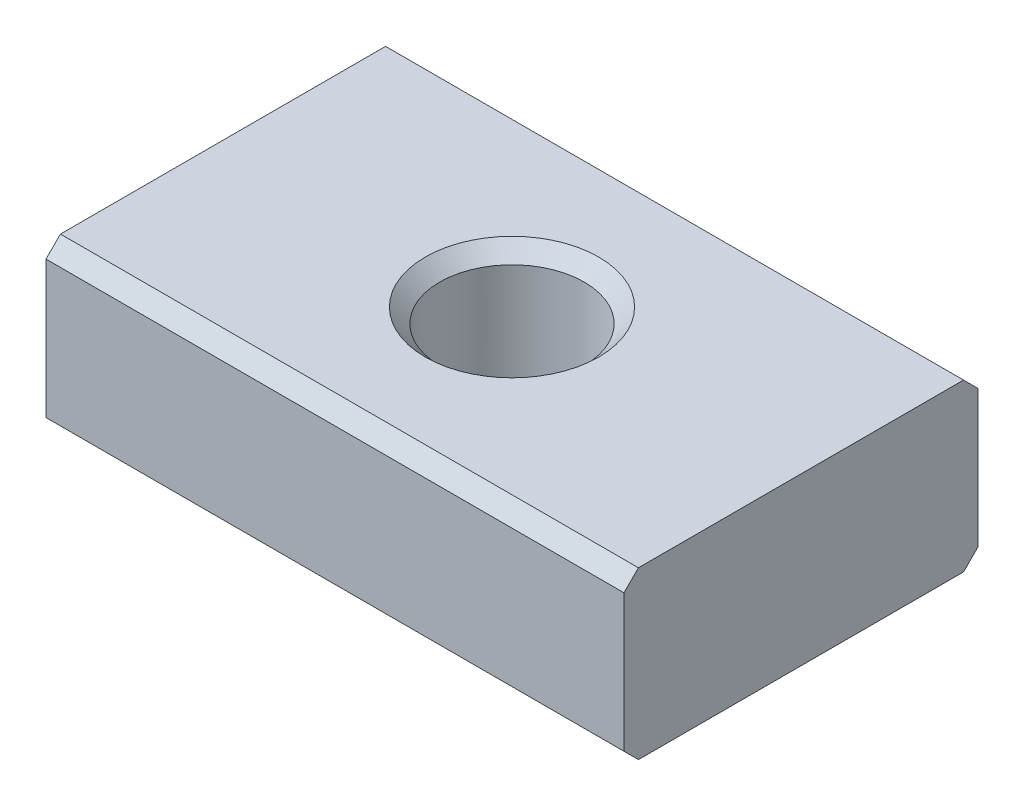
ISO-10303-21;
HEADER;
FILE_DESCRIPTION(('STEP AP214'),'2;1');
FILE_NAME('part.step','',(''),(''),'','','');
FILE_SCHEMA(('AUTOMOTIVE_DESIGN { 1 0 10303 214 1 1 1 1 }'));
ENDSEC;
DATA;
#1=APPLICATION_CONTEXT('core data for automotive mechanical design processes');
#2=APPLICATION_PROTOCOL_DEFINITION('international standard','automotive_design',2000,#1);
#3=PRODUCT_CONTEXT('',#1,'mechanical');
#4=PRODUCT('Part','Part','',(#3));
#5=PRODUCT_RELATED_PRODUCT_CATEGORY('part','',(#4));
#6=PRODUCT_DEFINITION_FORMATION('','',#4);
#7=PRODUCT_DEFINITION_CONTEXT('part definition',#1,'design');
#8=PRODUCT_DEFINITION('design','',#6,#7);
#9=PRODUCT_DEFINITION_SHAPE('','',#8);
#10=(LENGTH_UNIT() NAMED_UNIT(*) SI_UNIT(.MILLI.,.METRE.));
#11=(NAMED_UNIT(*) PLANE_ANGLE_UNIT() SI_UNIT($,.RADIAN.));
#12=(NAMED_UNIT(*) SI_UNIT($,.STERADIAN.) SOLID_ANGLE_UNIT());
#13=UNCERTAINTY_MEASURE_WITH_UNIT(LENGTH_MEASURE(1.E-05),#10,'distance_accuracy_value','');
#14=(GEOMETRIC_REPRESENTATION_CONTEXT(3) GLOBAL_UNCERTAINTY_ASSIGNED_CONTEXT((#13)) GLOBAL_UNIT_ASSIGNED_CONTEXT((#10,
#11,#12)) REPRESENTATION_CONTEXT('',''));
#15=CARTESIAN_POINT('',(0.,0.,0.));
#16=DIRECTION('',(0.,0.,1.));
#17=DIRECTION('',(1.,0.,0.));
#18=AXIS2_PLACEMENT_3D('',#15,#16,#17);
#19=CARTESIAN_POINT('',(238.313927280234,-604.415511703491,-854.486148834229));
#20=DIRECTION('',(0.,-0.707106781186548,-0.707106781186547));
#21=DIRECTION('',(0.,0.707106781186547,-0.707106781186548));
#22=AXIS2_PLACEMENT_3D('',#19,#20,#21);
#23=PLANE('',#22);
#24=DIRECTION('',(1.,0.,0.));
#25=VECTOR('',#24,1.);
#26=CARTESIAN_POINT('',(238.313927280234,-603.91551170349,-854.986148834229));
#27=LINE('',#26,#25);
#28=CARTESIAN_POINT('',(218.313933383242,-603.91551170349,-854.986148834229));
#29=VERTEX_POINT('',#28);
#30=CARTESIAN_POINT('',(258.313921177225,-603.91551170349,-854.986148834229));
#31=VERTEX_POINT('',#30);
#32=EDGE_CURVE('E116',#29,#31,#27,.T.);
#33=ORIENTED_EDGE('',*,*,#32,.F.);
#34=DIRECTION('',(0.,0.707106781186547,-0.707106781186548));
#35=VECTOR('',#34,1.);
#36=CARTESIAN_POINT('',(218.313933383242,-604.415511703491,-854.486148834229));
#37=LINE('',#36,#35);
#38=CARTESIAN_POINT('',(218.313933383242,-604.915511703492,-853.986148834228));
#39=VERTEX_POINT('',#38);
#40=EDGE_CURVE('E132',#39,#29,#37,.T.);
#41=ORIENTED_EDGE('',*,*,#40,.F.);
#42=DIRECTION('',(1.,0.,0.));
#43=VECTOR('',#42,1.);
#44=CARTESIAN_POINT('',(238.313927280234,-604.915511703492,-853.986148834228));
#45=LINE('',#44,#43);
#46=CARTESIAN_POINT('',(258.313921177225,-604.915511703492,-853.986148834228));
#47=VERTEX_POINT('',#46);
#48=EDGE_CURVE('E122',#47,#39,#45,.F.);
#49=ORIENTED_EDGE('',*,*,#48,.F.);
#50=DIRECTION('',(0.,0.707106781186547,-0.707106781186548));
#51=VECTOR('',#50,1.);
#52=CARTESIAN_POINT('',(258.313921177225,-604.415511703491,-854.486148834229));
#53=LINE('',#52,#51);
#54=EDGE_CURVE('E130',#31,#47,#53,.F.);
#55=ORIENTED_EDGE('',*,*,#54,.F.);
#56=EDGE_LOOP('',(#33,#41,#49,#55));
#57=FACE_BOUND('',#56,.T.);
#58=ADVANCED_FACE('F17',(#57),#23,.F.);
#59=CARTESIAN_POINT('',(238.313927280234,-604.415511703491,-877.986148834228));
#60=DIRECTION('',(0.,-0.707106781186548,0.707106781186547));
#61=DIRECTION('',(0.,-0.707106781186547,-0.707106781186548));
#62=AXIS2_PLACEMENT_3D('',#59,#60,#61);
#63=PLANE('',#62);
#64=DIRECTION('',(1.,0.,0.));
#65=VECTOR('',#64,1.);
#66=CARTESIAN_POINT('',(238.313927280234,-603.91551170349,-877.486148834228));
#67=LINE('',#66,#65);
#68=CARTESIAN_POINT('',(258.313921177225,-603.91551170349,-877.486148834228));
#69=VERTEX_POINT('',#68);
#70=CARTESIAN_POINT('',(218.313933383242,-603.91551170349,-877.486148834228));
#71=VERTEX_POINT('',#70);
#72=EDGE_CURVE('E119',#69,#71,#67,.F.);
#73=ORIENTED_EDGE('',*,*,#72,.F.);
#74=DIRECTION('',(0.,-0.707106781186547,-0.707106781186548));
#75=VECTOR('',#74,1.);
#76=CARTESIAN_POINT('',(258.313921177225,-604.415511703491,-877.986148834228));
#77=LINE('',#76,#75);
#78=CARTESIAN_POINT('',(258.313921177225,-604.915511703491,-878.486148834229));
#79=VERTEX_POINT('',#78);
#80=EDGE_CURVE('E78',#79,#69,#77,.F.);
#81=ORIENTED_EDGE('',*,*,#80,.F.);
#82=DIRECTION('',(1.,0.,0.));
#83=VECTOR('',#82,1.);
#84=CARTESIAN_POINT('',(238.313927280234,-604.915511703491,-878.486148834229));
#85=LINE('',#84,#83);
#86=CARTESIAN_POINT('',(218.313933383242,-604.915511703491,-878.486148834229));
#87=VERTEX_POINT('',#86);
#88=EDGE_CURVE('E99',#79,#87,#85,.F.);
#89=ORIENTED_EDGE('',*,*,#88,.T.);
#90=DIRECTION('',(0.,-0.707106781186547,-0.707106781186548));
#91=VECTOR('',#90,1.);
#92=CARTESIAN_POINT('',(218.313933383242,-604.415511703491,-877.986148834228));
#93=LINE('',#92,#91);
#94=EDGE_CURVE('E125',#71,#87,#93,.T.);
#95=ORIENTED_EDGE('',*,*,#94,.F.);
#96=EDGE_LOOP('',(#73,#81,#89,#95));
#97=FACE_BOUND('',#96,.T.);
#98=ADVANCED_FACE('F161',(#97),#63,.F.);
#99=CARTESIAN_POINT('',(238.313908971209,-603.91551170349,-866.236135779287));
#100=DIRECTION('',(0.,1.,0.));
#101=DIRECTION('',(0.,0.,1.));
#102=AXIS2_PLACEMENT_3D('',#99,#100,#101);
#103=CONICAL_SURFACE('',#102,6.00000000000001,0.785398163397448);
#104=CARTESIAN_POINT('',(238.313908971209,-604.915511703491,-866.236135779287));
#105=DIRECTION('',(0.,-1.,0.));
#106=DIRECTION('',(0.,0.,-1.));
#107=AXIS2_PLACEMENT_3D('',#104,#105,#106);
#108=CIRCLE('',#107,4.99999999999999);
#109=CARTESIAN_POINT('',(238.313908971209,-604.915511703491,-871.236135779287));
#110=VERTEX_POINT('',#109);
#111=EDGE_CURVE('E94',#110,#110,#108,.T.);
#112=ORIENTED_EDGE('',*,*,#111,.T.);
#113=EDGE_LOOP('',(#112));
#114=FACE_BOUND('',#113,.T.);
#115=CARTESIAN_POINT('',(238.313908971209,-603.91551170349,-866.236135779287));
#116=DIRECTION('',(0.,1.,0.));
#117=DIRECTION('',(0.,0.,1.));
#118=AXIS2_PLACEMENT_3D('',#115,#116,#117);
#119=CIRCLE('',#118,6.00000000000001);
#120=CARTESIAN_POINT('',(238.313908971209,-603.91551170349,-860.236135779287));
#121=VERTEX_POINT('',#120);
#122=EDGE_CURVE('E20',#121,#121,#119,.F.);
#123=ORIENTED_EDGE('',*,*,#122,.F.);
#124=EDGE_LOOP('',(#123));
#125=FACE_BOUND('',#124,.T.);
#126=ADVANCED_FACE('F176',(#114,#125),#103,.F.);
#127=CARTESIAN_POINT('',(238.313927280234,-609.66551170349,-853.986148834228));
#128=DIRECTION('',(0.,0.,1.));
#129=DIRECTION('',(1.,0.,0.));
#130=AXIS2_PLACEMENT_3D('',#127,#128,#129);
#131=PLANE('',#130);
#132=DIRECTION('',(1.,0.,0.));
#133=VECTOR('',#132,1.);
#134=CARTESIAN_POINT('',(238.313927280234,-614.415511703491,-853.986148834227));
#135=LINE('',#134,#133);
#136=CARTESIAN_POINT('',(218.313933383242,-614.41551170349,-853.986148834228));
#137=VERTEX_POINT('',#136);
#138=CARTESIAN_POINT('',(258.313921177225,-614.41551170349,-853.986148834228));
#139=VERTEX_POINT('',#138);
#140=EDGE_CURVE('E157',#137,#139,#135,.T.);
#141=ORIENTED_EDGE('',*,*,#140,.T.);
#142=DIRECTION('',(0.,1.,0.));
#143=VECTOR('',#142,1.);
#144=CARTESIAN_POINT('',(258.313921177225,-609.66551170349,-853.986148834228));
#145=LINE('',#144,#143);
#146=EDGE_CURVE('E159',#47,#139,#145,.F.);
#147=ORIENTED_EDGE('',*,*,#146,.F.);
#148=ORIENTED_EDGE('',*,*,#48,.T.);
#149=DIRECTION('',(0.,1.,0.));
#150=VECTOR('',#149,1.);
#151=CARTESIAN_POINT('',(218.313933383242,-609.66551170349,-853.986148834228));
#152=LINE('',#151,#150);
#153=EDGE_CURVE('E141',#137,#39,#152,.T.);
#154=ORIENTED_EDGE('',*,*,#153,.F.);
#155=EDGE_LOOP('',(#141,#147,#148,#154));
#156=FACE_BOUND('',#155,.T.);
#157=ADVANCED_FACE('F174',(#156),#131,.T.);
#158=CARTESIAN_POINT('',(238.313927280234,-603.91551170349,-866.23614883423));
#159=DIRECTION('',(0.,1.,0.));
#160=DIRECTION('',(0.,0.,1.));
#161=AXIS2_PLACEMENT_3D('',#158,#159,#160);
#162=PLANE('',#161);
#163=ORIENTED_EDGE('',*,*,#122,.T.);
#164=EDGE_LOOP('',(#163));
#165=FACE_BOUND('',#164,.T.);
#166=ORIENTED_EDGE('',*,*,#32,.T.);
#167=DIRECTION('',(0.,0.,-1.));
#168=VECTOR('',#167,1.);
#169=CARTESIAN_POINT('',(258.313921177225,-603.91551170349,-866.23614883423));
#170=LINE('',#169,#168);
#171=EDGE_CURVE('E101',#69,#31,#170,.F.);
#172=ORIENTED_EDGE('',*,*,#171,.F.);
#173=ORIENTED_EDGE('',*,*,#72,.T.);
#174=DIRECTION('',(0.,0.,1.));
#175=VECTOR('',#174,1.);
#176=CARTESIAN_POINT('',(218.313933383242,-603.91551170349,-866.23614883423));
#177=LINE('',#176,#175);
#178=EDGE_CURVE('E139',#29,#71,#177,.F.);
#179=ORIENTED_EDGE('',*,*,#178,.F.);
#180=EDGE_LOOP('',(#166,#172,#173,#179));
#181=FACE_BOUND('',#180,.T.);
#182=ADVANCED_FACE('F147',(#165,#181),#162,.T.);
#183=CARTESIAN_POINT('',(238.313927280234,-609.66551170349,-878.486148834229));
#184=DIRECTION('',(0.,0.,1.));
#185=DIRECTION('',(1.,0.,0.));
#186=AXIS2_PLACEMENT_3D('',#183,#184,#185);
#187=PLANE('',#186);
#188=DIRECTION('',(0.,1.,0.));
#189=VECTOR('',#188,1.);
#190=CARTESIAN_POINT('',(218.313933383242,-609.66551170349,-878.486148834229));
#191=LINE('',#190,#189);
#192=CARTESIAN_POINT('',(218.313933383242,-614.415511703491,-878.486148834229));
#193=VERTEX_POINT('',#192);
#194=EDGE_CURVE('E114',#87,#193,#191,.F.);
#195=ORIENTED_EDGE('',*,*,#194,.F.);
#196=ORIENTED_EDGE('',*,*,#88,.F.);
#197=DIRECTION('',(0.,1.,0.));
#198=VECTOR('',#197,1.);
#199=CARTESIAN_POINT('',(258.313921177225,-609.66551170349,-878.486148834229));
#200=LINE('',#199,#198);
#201=CARTESIAN_POINT('',(258.313921177225,-614.415511703491,-878.486148834229));
#202=VERTEX_POINT('',#201);
#203=EDGE_CURVE('E97',#202,#79,#200,.T.);
#204=ORIENTED_EDGE('',*,*,#203,.F.);
#205=DIRECTION('',(1.,0.,0.));
#206=VECTOR('',#205,1.);
#207=CARTESIAN_POINT('',(238.313927280234,-614.415511703491,-878.486148834229));
#208=LINE('',#207,#206);
#209=EDGE_CURVE('E83',#202,#193,#208,.F.);
#210=ORIENTED_EDGE('',*,*,#209,.T.);
#211=EDGE_LOOP('',(#195,#196,#204,#210));
#212=FACE_BOUND('',#211,.T.);
#213=ADVANCED_FACE('F98',(#212),#187,.F.);
#214=CARTESIAN_POINT('',(238.313908971209,-615.41551170349,-866.236135779287));
#215=DIRECTION('',(0.,-1.,0.));
#216=DIRECTION('',(0.,0.,-1.));
#217=AXIS2_PLACEMENT_3D('',#214,#215,#216);
#218=CYLINDRICAL_SURFACE('',#217,4.99999999999999);
#219=CARTESIAN_POINT('',(238.313908971209,-614.415511703491,-866.236135779287));
#220=DIRECTION('',(0.,-1.,0.));
#221=DIRECTION('',(1.,0.,0.));
#222=AXIS2_PLACEMENT_3D('',#219,#220,#221);
#223=CIRCLE('',#222,5.00000000000056);
#224=CARTESIAN_POINT('',(243.31390897121,-614.415511703491,-866.236135779287));
#225=VERTEX_POINT('',#224);
#226=EDGE_CURVE('E110',#225,#225,#223,.T.);
#227=ORIENTED_EDGE('',*,*,#226,.T.);
#228=EDGE_LOOP('',(#227));
#229=FACE_BOUND('',#228,.T.);
#230=ORIENTED_EDGE('',*,*,#111,.F.);
#231=EDGE_LOOP('',(#230));
#232=FACE_BOUND('',#231,.T.);
#233=ADVANCED_FACE('F205',(#229,#232),#218,.F.);
#234=CARTESIAN_POINT('',(238.313927280234,-614.915511703492,-877.986148834228));
#235=DIRECTION('',(0.,0.707106781186548,0.707106781186547));
#236=DIRECTION('',(0.,-0.707106781186547,0.707106781186548));
#237=AXIS2_PLACEMENT_3D('',#234,#235,#236);
#238=PLANE('',#237);
#239=DIRECTION('',(1.,0.,0.));
#240=VECTOR('',#239,1.);
#241=CARTESIAN_POINT('',(238.313927280234,-615.41551170349,-877.48614883423));
#242=LINE('',#241,#240);
#243=CARTESIAN_POINT('',(218.313933383242,-615.41551170349,-877.48614883423));
#244=VERTEX_POINT('',#243);
#245=CARTESIAN_POINT('',(258.313921177225,-615.41551170349,-877.48614883423));
#246=VERTEX_POINT('',#245);
#247=EDGE_CURVE('E113',#244,#246,#242,.T.);
#248=ORIENTED_EDGE('',*,*,#247,.F.);
#249=DIRECTION('',(0.,-0.707106781186508,0.707106781186587));
#250=VECTOR('',#249,1.);
#251=CARTESIAN_POINT('',(218.313933383242,-614.415511703491,-878.486148834229));
#252=LINE('',#251,#250);
#253=EDGE_CURVE('E90',#193,#244,#252,.T.);
#254=ORIENTED_EDGE('',*,*,#253,.F.);
#255=ORIENTED_EDGE('',*,*,#209,.F.);
#256=DIRECTION('',(0.,0.707106781186155,-0.70710678118694));
#257=VECTOR('',#256,1.);
#258=CARTESIAN_POINT('',(258.313921177225,-615.41551170349,-877.486148834229));
#259=LINE('',#258,#257);
#260=EDGE_CURVE('E87',#246,#202,#259,.T.);
#261=ORIENTED_EDGE('',*,*,#260,.F.);
#262=EDGE_LOOP('',(#248,#254,#255,#261));
#263=FACE_BOUND('',#262,.T.);
#264=ADVANCED_FACE('F85',(#263),#238,.F.);
#265=CARTESIAN_POINT('',(258.313921177225,-609.66551170349,-866.23614883423));
#266=DIRECTION('',(1.,0.,0.));
#267=DIRECTION('',(0.,0.,-1.));
#268=AXIS2_PLACEMENT_3D('',#265,#266,#267);
#269=PLANE('',#268);
#270=DIRECTION('',(0.,0.707106781186547,0.707106781186548));
#271=VECTOR('',#270,1.);
#272=CARTESIAN_POINT('',(258.313921177225,-614.915511703492,-854.486148834229));
#273=LINE('',#272,#271);
#274=CARTESIAN_POINT('',(258.313921177225,-615.41551170349,-854.986148834229));
#275=VERTEX_POINT('',#274);
#276=EDGE_CURVE('E155',#139,#275,#273,.F.);
#277=ORIENTED_EDGE('',*,*,#276,.T.);
#278=DIRECTION('',(0.,0.,-1.));
#279=VECTOR('',#278,1.);
#280=CARTESIAN_POINT('',(258.313921177225,-615.41551170349,-866.23614883423));
#281=LINE('',#280,#279);
#282=EDGE_CURVE('E105',#246,#275,#281,.F.);
#283=ORIENTED_EDGE('',*,*,#282,.F.);
#284=ORIENTED_EDGE('',*,*,#260,.T.);
#285=ORIENTED_EDGE('',*,*,#203,.T.);
#286=ORIENTED_EDGE('',*,*,#80,.T.);
#287=ORIENTED_EDGE('',*,*,#171,.T.);
#288=ORIENTED_EDGE('',*,*,#54,.T.);
#289=ORIENTED_EDGE('',*,*,#146,.T.);
#290=EDGE_LOOP('',(#277,#283,#284,#285,#286,#287,#288,#289));
#291=FACE_BOUND('',#290,.T.);
#292=ADVANCED_FACE('F103',(#291),#269,.T.);
#293=CARTESIAN_POINT('',(238.313927280234,-614.915511703492,-854.486148834229));
#294=DIRECTION('',(0.,0.707106781186548,-0.707106781186547));
#295=DIRECTION('',(0.,0.707106781186547,0.707106781186548));
#296=AXIS2_PLACEMENT_3D('',#293,#294,#295);
#297=PLANE('',#296);
#298=DIRECTION('',(1.,0.,0.));
#299=VECTOR('',#298,1.);
#300=CARTESIAN_POINT('',(238.313927280234,-615.41551170349,-854.986148834229));
#301=LINE('',#300,#299);
#302=CARTESIAN_POINT('',(218.313933383242,-615.415511703491,-854.986148834228));
#303=VERTEX_POINT('',#302);
#304=EDGE_CURVE('E166',#275,#303,#301,.F.);
#305=ORIENTED_EDGE('',*,*,#304,.F.);
#306=ORIENTED_EDGE('',*,*,#276,.F.);
#307=ORIENTED_EDGE('',*,*,#140,.F.);
#308=DIRECTION('',(0.,0.707106781186862,0.707106781186233));
#309=VECTOR('',#308,1.);
#310=CARTESIAN_POINT('',(218.313933383242,-615.41551170349,-854.986148834227));
#311=LINE('',#310,#309);
#312=EDGE_CURVE('E34',#303,#137,#311,.T.);
#313=ORIENTED_EDGE('',*,*,#312,.F.);
#314=EDGE_LOOP('',(#305,#306,#307,#313));
#315=FACE_BOUND('',#314,.T.);
#316=ADVANCED_FACE('F171',(#315),#297,.F.);
#317=CARTESIAN_POINT('',(218.313933383242,-609.66551170349,-866.23614883423));
#318=DIRECTION('',(-1.,0.,0.));
#319=DIRECTION('',(0.,0.,1.));
#320=AXIS2_PLACEMENT_3D('',#317,#318,#319);
#321=PLANE('',#320);
#322=ORIENTED_EDGE('',*,*,#94,.T.);
#323=ORIENTED_EDGE('',*,*,#194,.T.);
#324=ORIENTED_EDGE('',*,*,#253,.T.);
#325=DIRECTION('',(0.,0.,-1.));
#326=VECTOR('',#325,1.);
#327=CARTESIAN_POINT('',(218.313933383242,-615.41551170349,-866.23614883423));
#328=LINE('',#327,#326);
#329=EDGE_CURVE('E26',#303,#244,#328,.T.);
#330=ORIENTED_EDGE('',*,*,#329,.F.);
#331=ORIENTED_EDGE('',*,*,#312,.T.);
#332=ORIENTED_EDGE('',*,*,#153,.T.);
#333=ORIENTED_EDGE('',*,*,#40,.T.);
#334=ORIENTED_EDGE('',*,*,#178,.T.);
#335=EDGE_LOOP('',(#322,#323,#324,#330,#331,#332,#333,#334));
#336=FACE_BOUND('',#335,.T.);
#337=ADVANCED_FACE('F137',(#336),#321,.T.);
#338=CARTESIAN_POINT('',(238.313908971209,-615.41551170349,-866.236135779287));
#339=DIRECTION('',(0.,-1.,0.));
#340=DIRECTION('',(0.,0.,-1.));
#341=AXIS2_PLACEMENT_3D('',#338,#339,#340);
#342=CONICAL_SURFACE('',#341,6.00000000000001,0.785398163397448);
#343=ORIENTED_EDGE('',*,*,#226,.F.);
#344=EDGE_LOOP('',(#343));
#345=FACE_BOUND('',#344,.T.);
#346=CARTESIAN_POINT('',(238.313908971209,-615.41551170349,-866.236135779287));
#347=DIRECTION('',(0.,-1.,0.));
#348=DIRECTION('',(0.,0.,-1.));
#349=AXIS2_PLACEMENT_3D('',#346,#347,#348);
#350=CIRCLE('',#349,6.00000000000001);
#351=CARTESIAN_POINT('',(238.313908971209,-615.41551170349,-872.236135779287));
#352=VERTEX_POINT('',#351);
#353=EDGE_CURVE('E11',#352,#352,#350,.F.);
#354=ORIENTED_EDGE('',*,*,#353,.F.);
#355=EDGE_LOOP('',(#354));
#356=FACE_BOUND('',#355,.T.);
#357=ADVANCED_FACE('F188',(#345,#356),#342,.F.);
#358=CARTESIAN_POINT('',(238.313927280234,-615.41551170349,-866.23614883423));
#359=DIRECTION('',(0.,-1.,0.));
#360=DIRECTION('',(0.,0.,-1.));
#361=AXIS2_PLACEMENT_3D('',#358,#359,#360);
#362=PLANE('',#361);
#363=ORIENTED_EDGE('',*,*,#353,.T.);
#364=EDGE_LOOP('',(#363));
#365=FACE_BOUND('',#364,.T.);
#366=ORIENTED_EDGE('',*,*,#304,.T.);
#367=ORIENTED_EDGE('',*,*,#329,.T.);
#368=ORIENTED_EDGE('',*,*,#247,.T.);
#369=ORIENTED_EDGE('',*,*,#282,.T.);
#370=EDGE_LOOP('',(#366,#367,#368,#369));
#371=FACE_BOUND('',#370,.T.);
#372=ADVANCED_FACE('F165',(#365,#371),#362,.T.);
#373=CLOSED_SHELL('',(#58,#98,#126,#157,#182,#213,#233,#264,#292,#316,#337,#357,#372));
#374=MANIFOLD_SOLID_BREP('B1',#373);
#375=ADVANCED_BREP_SHAPE_REPRESENTATION('',(#18,#374),#14);
#376=SHAPE_DEFINITION_REPRESENTATION(#9,#375);
ENDSEC;
END-ISO-10303-21;
